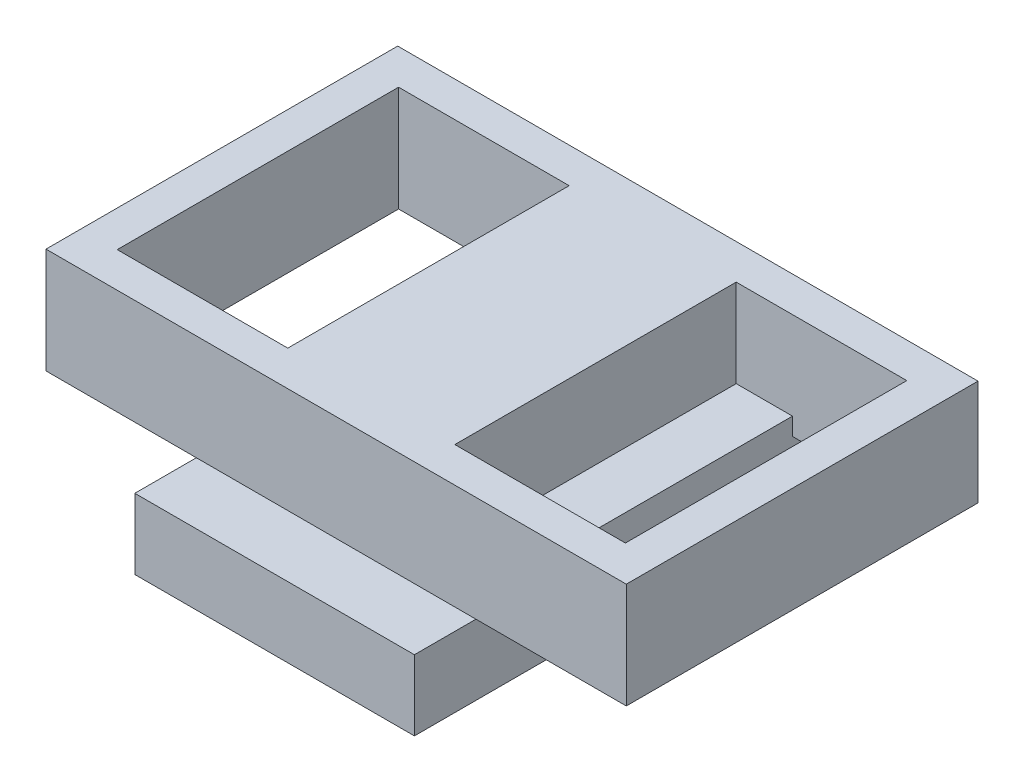
ISO-10303-21;
HEADER;
FILE_DESCRIPTION(('STEP AP214'),'2;1');
FILE_NAME('part.step','',(''),(''),'','','');
FILE_SCHEMA(('AUTOMOTIVE_DESIGN { 1 0 10303 214 1 1 1 1 }'));
ENDSEC;
DATA;
#1=APPLICATION_CONTEXT('core data for automotive mechanical design processes');
#2=APPLICATION_PROTOCOL_DEFINITION('international standard','automotive_design',2000,#1);
#3=PRODUCT_CONTEXT('',#1,'mechanical');
#4=PRODUCT('Part','Part','',(#3));
#5=PRODUCT_RELATED_PRODUCT_CATEGORY('part','',(#4));
#6=PRODUCT_DEFINITION_FORMATION('','',#4);
#7=PRODUCT_DEFINITION_CONTEXT('part definition',#1,'design');
#8=PRODUCT_DEFINITION('design','',#6,#7);
#9=PRODUCT_DEFINITION_SHAPE('','',#8);
#10=(LENGTH_UNIT() NAMED_UNIT(*) SI_UNIT(.MILLI.,.METRE.));
#11=(NAMED_UNIT(*) PLANE_ANGLE_UNIT() SI_UNIT($,.RADIAN.));
#12=(NAMED_UNIT(*) SI_UNIT($,.STERADIAN.) SOLID_ANGLE_UNIT());
#13=UNCERTAINTY_MEASURE_WITH_UNIT(LENGTH_MEASURE(1.E-05),#10,'distance_accuracy_value','');
#14=(GEOMETRIC_REPRESENTATION_CONTEXT(3) GLOBAL_UNCERTAINTY_ASSIGNED_CONTEXT((#13)) GLOBAL_UNIT_ASSIGNED_CONTEXT((#10,
#11,#12)) REPRESENTATION_CONTEXT('',''));
#15=CARTESIAN_POINT('',(0.,0.,0.));
#16=DIRECTION('',(0.,0.,1.));
#17=DIRECTION('',(1.,0.,0.));
#18=AXIS2_PLACEMENT_3D('',#15,#16,#17);
#19=CARTESIAN_POINT('',(0.,0.,0.));
#20=DIRECTION('',(0.,1.,0.));
#21=DIRECTION('',(0.,0.,1.));
#22=AXIS2_PLACEMENT_3D('',#19,#20,#21);
#23=PLANE('',#22);
#24=DIRECTION('',(0.,0.,-1.));
#25=VECTOR('',#24,1.);
#26=CARTESIAN_POINT('',(-7.95,0.,-13.5));
#27=LINE('',#26,#25);
#28=CARTESIAN_POINT('',(-7.95,0.,10.));
#29=VERTEX_POINT('',#28);
#30=CARTESIAN_POINT('',(-7.95,0.,8.));
#31=VERTEX_POINT('',#30);
#32=EDGE_CURVE('E11',#29,#31,#27,.T.);
#33=ORIENTED_EDGE('',*,*,#32,.F.);
#34=DIRECTION('',(1.,0.,0.));
#35=VECTOR('',#34,1.);
#36=CARTESIAN_POINT('',(16.5,0.,10.));
#37=LINE('',#36,#35);
#38=CARTESIAN_POINT('',(-16.5,0.,10.));
#39=VERTEX_POINT('',#38);
#40=EDGE_CURVE('E375',#39,#29,#37,.T.);
#41=ORIENTED_EDGE('',*,*,#40,.F.);
#42=DIRECTION('',(0.,0.,1.));
#43=VECTOR('',#42,1.);
#44=CARTESIAN_POINT('',(-16.5,0.,10.));
#45=LINE('',#44,#43);
#46=CARTESIAN_POINT('',(-16.5,0.,-9.99999999999999));
#47=VERTEX_POINT('',#46);
#48=EDGE_CURVE('E325',#47,#39,#45,.T.);
#49=ORIENTED_EDGE('',*,*,#48,.F.);
#50=DIRECTION('',(-1.,0.,0.));
#51=VECTOR('',#50,1.);
#52=CARTESIAN_POINT('',(16.5,0.,-10.));
#53=LINE('',#52,#51);
#54=CARTESIAN_POINT('',(-7.95,0.,-9.99999999999999));
#55=VERTEX_POINT('',#54);
#56=EDGE_CURVE('E380',#55,#47,#53,.T.);
#57=ORIENTED_EDGE('',*,*,#56,.F.);
#58=CARTESIAN_POINT('',(-7.95,0.,-8.));
#59=VERTEX_POINT('',#58);
#60=EDGE_CURVE('E42',#59,#55,#27,.T.);
#61=ORIENTED_EDGE('',*,*,#60,.F.);
#62=DIRECTION('',(1.,0.,0.));
#63=VECTOR('',#62,1.);
#64=CARTESIAN_POINT('',(0.,0.,-8.00000000000001));
#65=LINE('',#64,#63);
#66=CARTESIAN_POINT('',(-14.45,0.,-8.));
#67=VERTEX_POINT('',#66);
#68=EDGE_CURVE('E279',#67,#59,#65,.T.);
#69=ORIENTED_EDGE('',*,*,#68,.F.);
#70=DIRECTION('',(0.,0.,1.));
#71=VECTOR('',#70,1.);
#72=CARTESIAN_POINT('',(-14.45,0.,0.));
#73=LINE('',#72,#71);
#74=CARTESIAN_POINT('',(-14.45,0.,8.));
#75=VERTEX_POINT('',#74);
#76=EDGE_CURVE('E282',#67,#75,#73,.T.);
#77=ORIENTED_EDGE('',*,*,#76,.T.);
#78=DIRECTION('',(1.,0.,0.));
#79=VECTOR('',#78,1.);
#80=CARTESIAN_POINT('',(0.,0.,7.99999999999999));
#81=LINE('',#80,#79);
#82=EDGE_CURVE('E286',#75,#31,#81,.T.);
#83=ORIENTED_EDGE('',*,*,#82,.T.);
#84=EDGE_LOOP('',(#33,#41,#49,#57,#61,#69,#77,#83));
#85=FACE_BOUND('',#84,.T.);
#86=ADVANCED_FACE('F33',(#85),#23,.F.);
#87=DIRECTION('',(0.,0.,1.));
#88=VECTOR('',#87,1.);
#89=CARTESIAN_POINT('',(7.95,0.,-13.5));
#90=LINE('',#89,#88);
#91=CARTESIAN_POINT('',(7.95,0.,-9.99999999999999));
#92=VERTEX_POINT('',#91);
#93=CARTESIAN_POINT('',(7.95,0.,-8.00000000000001));
#94=VERTEX_POINT('',#93);
#95=EDGE_CURVE('E405',#92,#94,#90,.T.);
#96=ORIENTED_EDGE('',*,*,#95,.F.);
#97=CARTESIAN_POINT('',(16.5,0.,-10.));
#98=VERTEX_POINT('',#97);
#99=EDGE_CURVE('E365',#98,#92,#53,.T.);
#100=ORIENTED_EDGE('',*,*,#99,.F.);
#101=DIRECTION('',(0.,0.,-1.));
#102=VECTOR('',#101,1.);
#103=CARTESIAN_POINT('',(16.5,0.,10.));
#104=LINE('',#103,#102);
#105=CARTESIAN_POINT('',(16.5,0.,10.));
#106=VERTEX_POINT('',#105);
#107=EDGE_CURVE('E377',#106,#98,#104,.T.);
#108=ORIENTED_EDGE('',*,*,#107,.F.);
#109=CARTESIAN_POINT('',(7.95,0.,10.));
#110=VERTEX_POINT('',#109);
#111=EDGE_CURVE('E374',#110,#106,#37,.T.);
#112=ORIENTED_EDGE('',*,*,#111,.F.);
#113=CARTESIAN_POINT('',(7.95,0.,7.99999999999999));
#114=VERTEX_POINT('',#113);
#115=EDGE_CURVE('E265',#114,#110,#90,.T.);
#116=ORIENTED_EDGE('',*,*,#115,.F.);
#117=DIRECTION('',(-1.,0.,0.));
#118=VECTOR('',#117,1.);
#119=CARTESIAN_POINT('',(0.,0.,7.99999999999999));
#120=LINE('',#119,#118);
#121=CARTESIAN_POINT('',(14.45,0.,8.));
#122=VERTEX_POINT('',#121);
#123=EDGE_CURVE('E295',#122,#114,#120,.T.);
#124=ORIENTED_EDGE('',*,*,#123,.F.);
#125=DIRECTION('',(0.,0.,1.));
#126=VECTOR('',#125,1.);
#127=CARTESIAN_POINT('',(14.45,0.,0.));
#128=LINE('',#127,#126);
#129=CARTESIAN_POINT('',(14.45,0.,-8.));
#130=VERTEX_POINT('',#129);
#131=EDGE_CURVE('E298',#130,#122,#128,.T.);
#132=ORIENTED_EDGE('',*,*,#131,.F.);
#133=DIRECTION('',(-1.,0.,0.));
#134=VECTOR('',#133,1.);
#135=CARTESIAN_POINT('',(0.,0.,-8.00000000000001));
#136=LINE('',#135,#134);
#137=EDGE_CURVE('E278',#130,#94,#136,.T.);
#138=ORIENTED_EDGE('',*,*,#137,.T.);
#139=EDGE_LOOP('',(#96,#100,#108,#112,#116,#124,#132,#138));
#140=FACE_BOUND('',#139,.T.);
#141=ADVANCED_FACE('F459',(#140),#23,.F.);
#142=CARTESIAN_POINT('',(0.,1.,0.));
#143=DIRECTION('',(0.,1.,0.));
#144=DIRECTION('',(0.,0.,1.));
#145=AXIS2_PLACEMENT_3D('',#142,#143,#144);
#146=PLANE('',#145);
#147=DIRECTION('',(1.,0.,0.));
#148=VECTOR('',#147,1.);
#149=CARTESIAN_POINT('',(-14.45,1.,-8.));
#150=LINE('',#149,#148);
#151=CARTESIAN_POINT('',(-7.95,1.,-8.));
#152=VERTEX_POINT('',#151);
#153=CARTESIAN_POINT('',(-4.75,1.,-8.00000000000001));
#154=VERTEX_POINT('',#153);
#155=EDGE_CURVE('E311',#152,#154,#150,.T.);
#156=ORIENTED_EDGE('',*,*,#155,.F.);
#157=DIRECTION('',(0.,0.,1.));
#158=VECTOR('',#157,1.);
#159=CARTESIAN_POINT('',(-7.95,1.,0.));
#160=LINE('',#159,#158);
#161=CARTESIAN_POINT('',(-7.95,1.,8.));
#162=VERTEX_POINT('',#161);
#163=EDGE_CURVE('E394',#152,#162,#160,.T.);
#164=ORIENTED_EDGE('',*,*,#163,.T.);
#165=DIRECTION('',(1.,0.,0.));
#166=VECTOR('',#165,1.);
#167=CARTESIAN_POINT('',(-14.45,1.,8.));
#168=LINE('',#167,#166);
#169=CARTESIAN_POINT('',(-4.75,1.,7.99999999999999));
#170=VERTEX_POINT('',#169);
#171=EDGE_CURVE('E305',#162,#170,#168,.T.);
#172=ORIENTED_EDGE('',*,*,#171,.T.);
#173=DIRECTION('',(0.,0.,1.));
#174=VECTOR('',#173,1.);
#175=CARTESIAN_POINT('',(-4.75,1.,-8.00000000000001));
#176=LINE('',#175,#174);
#177=EDGE_CURVE('E307',#154,#170,#176,.T.);
#178=ORIENTED_EDGE('',*,*,#177,.F.);
#179=EDGE_LOOP('',(#156,#164,#172,#178));
#180=FACE_BOUND('',#179,.T.);
#181=ADVANCED_FACE('F479',(#180),#146,.T.);
#182=CARTESIAN_POINT('',(0.,6.,0.));
#183=DIRECTION('',(0.,1.,0.));
#184=DIRECTION('',(0.,0.,1.));
#185=AXIS2_PLACEMENT_3D('',#182,#183,#184);
#186=PLANE('',#185);
#187=DIRECTION('',(0.,0.,1.));
#188=VECTOR('',#187,1.);
#189=CARTESIAN_POINT('',(-14.45,6.,-8.));
#190=LINE('',#189,#188);
#191=CARTESIAN_POINT('',(-14.45,6.,-8.));
#192=VERTEX_POINT('',#191);
#193=CARTESIAN_POINT('',(-14.45,6.,8.));
#194=VERTEX_POINT('',#193);
#195=EDGE_CURVE('E314',#192,#194,#190,.T.);
#196=ORIENTED_EDGE('',*,*,#195,.F.);
#197=DIRECTION('',(1.,0.,0.));
#198=VECTOR('',#197,1.);
#199=CARTESIAN_POINT('',(-14.45,6.,-8.));
#200=LINE('',#199,#198);
#201=CARTESIAN_POINT('',(-4.75,6.,-8.00000000000001));
#202=VERTEX_POINT('',#201);
#203=EDGE_CURVE('E308',#192,#202,#200,.T.);
#204=ORIENTED_EDGE('',*,*,#203,.T.);
#205=DIRECTION('',(0.,0.,1.));
#206=VECTOR('',#205,1.);
#207=CARTESIAN_POINT('',(-4.75,6.,-8.00000000000001));
#208=LINE('',#207,#206);
#209=CARTESIAN_POINT('',(-4.75,6.,7.99999999999999));
#210=VERTEX_POINT('',#209);
#211=EDGE_CURVE('E319',#202,#210,#208,.T.);
#212=ORIENTED_EDGE('',*,*,#211,.T.);
#213=DIRECTION('',(1.,0.,0.));
#214=VECTOR('',#213,1.);
#215=CARTESIAN_POINT('',(-14.45,6.,8.));
#216=LINE('',#215,#214);
#217=EDGE_CURVE('E316',#194,#210,#216,.T.);
#218=ORIENTED_EDGE('',*,*,#217,.F.);
#219=EDGE_LOOP('',(#196,#204,#212,#218));
#220=FACE_BOUND('',#219,.T.);
#221=DIRECTION('',(0.,0.,1.));
#222=VECTOR('',#221,1.);
#223=CARTESIAN_POINT('',(-16.5,6.,10.));
#224=LINE('',#223,#222);
#225=CARTESIAN_POINT('',(-16.5,6.,-9.99999999999999));
#226=VERTEX_POINT('',#225);
#227=CARTESIAN_POINT('',(-16.5,6.,10.));
#228=VERTEX_POINT('',#227);
#229=EDGE_CURVE('E361',#226,#228,#224,.T.);
#230=ORIENTED_EDGE('',*,*,#229,.T.);
#231=DIRECTION('',(1.,0.,0.));
#232=VECTOR('',#231,1.);
#233=CARTESIAN_POINT('',(16.5,6.,10.));
#234=LINE('',#233,#232);
#235=CARTESIAN_POINT('',(16.5,6.,10.));
#236=VERTEX_POINT('',#235);
#237=EDGE_CURVE('E364',#228,#236,#234,.T.);
#238=ORIENTED_EDGE('',*,*,#237,.T.);
#239=DIRECTION('',(0.,0.,-1.));
#240=VECTOR('',#239,1.);
#241=CARTESIAN_POINT('',(16.5,6.,10.));
#242=LINE('',#241,#240);
#243=CARTESIAN_POINT('',(16.5,6.,-10.));
#244=VERTEX_POINT('',#243);
#245=EDGE_CURVE('E367',#236,#244,#242,.T.);
#246=ORIENTED_EDGE('',*,*,#245,.T.);
#247=DIRECTION('',(-1.,0.,0.));
#248=VECTOR('',#247,1.);
#249=CARTESIAN_POINT('',(16.5,6.,-10.));
#250=LINE('',#249,#248);
#251=EDGE_CURVE('E369',#244,#226,#250,.T.);
#252=ORIENTED_EDGE('',*,*,#251,.T.);
#253=EDGE_LOOP('',(#230,#238,#246,#252));
#254=FACE_BOUND('',#253,.T.);
#255=DIRECTION('',(-1.,0.,0.));
#256=VECTOR('',#255,1.);
#257=CARTESIAN_POINT('',(14.45,6.,-8.));
#258=LINE('',#257,#256);
#259=CARTESIAN_POINT('',(14.45,6.,-8.));
#260=VERTEX_POINT('',#259);
#261=CARTESIAN_POINT('',(4.75,6.,-8.00000000000001));
#262=VERTEX_POINT('',#261);
#263=EDGE_CURVE('E346',#260,#262,#258,.T.);
#264=ORIENTED_EDGE('',*,*,#263,.F.);
#265=DIRECTION('',(0.,0.,1.));
#266=VECTOR('',#265,1.);
#267=CARTESIAN_POINT('',(14.45,6.,-8.));
#268=LINE('',#267,#266);
#269=CARTESIAN_POINT('',(14.45,6.,8.));
#270=VERTEX_POINT('',#269);
#271=EDGE_CURVE('E317',#260,#270,#268,.T.);
#272=ORIENTED_EDGE('',*,*,#271,.T.);
#273=DIRECTION('',(-1.,0.,0.));
#274=VECTOR('',#273,1.);
#275=CARTESIAN_POINT('',(14.45,6.,8.));
#276=LINE('',#275,#274);
#277=CARTESIAN_POINT('',(4.75,6.,7.99999999999999));
#278=VERTEX_POINT('',#277);
#279=EDGE_CURVE('E352',#270,#278,#276,.T.);
#280=ORIENTED_EDGE('',*,*,#279,.T.);
#281=DIRECTION('',(0.,0.,1.));
#282=VECTOR('',#281,1.);
#283=CARTESIAN_POINT('',(4.75,6.,-8.00000000000001));
#284=LINE('',#283,#282);
#285=EDGE_CURVE('E348',#262,#278,#284,.T.);
#286=ORIENTED_EDGE('',*,*,#285,.F.);
#287=EDGE_LOOP('',(#264,#272,#280,#286));
#288=FACE_BOUND('',#287,.T.);
#289=ADVANCED_FACE('F452',(#220,#254,#288),#186,.T.);
#290=CARTESIAN_POINT('',(-16.5,6.,10.));
#291=DIRECTION('',(1.,0.,0.));
#292=DIRECTION('',(0.,0.,-1.));
#293=AXIS2_PLACEMENT_3D('',#290,#291,#292);
#294=PLANE('',#293);
#295=ORIENTED_EDGE('',*,*,#48,.T.);
#296=DIRECTION('',(0.,-1.,0.));
#297=VECTOR('',#296,1.);
#298=CARTESIAN_POINT('',(-16.5,6.,10.));
#299=LINE('',#298,#297);
#300=EDGE_CURVE('E392',#228,#39,#299,.T.);
#301=ORIENTED_EDGE('',*,*,#300,.F.);
#302=ORIENTED_EDGE('',*,*,#229,.F.);
#303=DIRECTION('',(0.,-1.,0.));
#304=VECTOR('',#303,1.);
#305=CARTESIAN_POINT('',(-16.5,6.,-9.99999999999999));
#306=LINE('',#305,#304);
#307=EDGE_CURVE('E371',#226,#47,#306,.T.);
#308=ORIENTED_EDGE('',*,*,#307,.T.);
#309=EDGE_LOOP('',(#295,#301,#302,#308));
#310=FACE_BOUND('',#309,.T.);
#311=ADVANCED_FACE('F35',(#310),#294,.F.);
#312=CARTESIAN_POINT('',(16.5,6.,10.));
#313=DIRECTION('',(0.,0.,-1.));
#314=DIRECTION('',(-1.,0.,0.));
#315=AXIS2_PLACEMENT_3D('',#312,#313,#314);
#316=PLANE('',#315);
#317=ORIENTED_EDGE('',*,*,#40,.T.);
#318=EDGE_CURVE('E378',#29,#110,#37,.T.);
#319=ORIENTED_EDGE('',*,*,#318,.T.);
#320=ORIENTED_EDGE('',*,*,#111,.T.);
#321=DIRECTION('',(0.,-1.,0.));
#322=VECTOR('',#321,1.);
#323=CARTESIAN_POINT('',(16.5,6.,10.));
#324=LINE('',#323,#322);
#325=EDGE_CURVE('E389',#236,#106,#324,.T.);
#326=ORIENTED_EDGE('',*,*,#325,.F.);
#327=ORIENTED_EDGE('',*,*,#237,.F.);
#328=ORIENTED_EDGE('',*,*,#300,.T.);
#329=EDGE_LOOP('',(#317,#319,#320,#326,#327,#328));
#330=FACE_BOUND('',#329,.T.);
#331=ADVANCED_FACE('F448',(#330),#316,.F.);
#332=CARTESIAN_POINT('',(16.5,6.,10.));
#333=DIRECTION('',(-1.,0.,0.));
#334=DIRECTION('',(0.,0.,1.));
#335=AXIS2_PLACEMENT_3D('',#332,#333,#334);
#336=PLANE('',#335);
#337=ORIENTED_EDGE('',*,*,#107,.T.);
#338=DIRECTION('',(0.,-1.,0.));
#339=VECTOR('',#338,1.);
#340=CARTESIAN_POINT('',(16.5,6.,-10.));
#341=LINE('',#340,#339);
#342=EDGE_CURVE('E386',#244,#98,#341,.T.);
#343=ORIENTED_EDGE('',*,*,#342,.F.);
#344=ORIENTED_EDGE('',*,*,#245,.F.);
#345=ORIENTED_EDGE('',*,*,#325,.T.);
#346=EDGE_LOOP('',(#337,#343,#344,#345));
#347=FACE_BOUND('',#346,.T.);
#348=ADVANCED_FACE('F497',(#347),#336,.F.);
#349=CARTESIAN_POINT('',(16.5,6.,-10.));
#350=DIRECTION('',(0.,0.,1.));
#351=DIRECTION('',(1.,0.,0.));
#352=AXIS2_PLACEMENT_3D('',#349,#350,#351);
#353=PLANE('',#352);
#354=ORIENTED_EDGE('',*,*,#99,.T.);
#355=EDGE_CURVE('E383',#92,#55,#53,.T.);
#356=ORIENTED_EDGE('',*,*,#355,.T.);
#357=ORIENTED_EDGE('',*,*,#56,.T.);
#358=ORIENTED_EDGE('',*,*,#307,.F.);
#359=ORIENTED_EDGE('',*,*,#251,.F.);
#360=ORIENTED_EDGE('',*,*,#342,.T.);
#361=EDGE_LOOP('',(#354,#356,#357,#358,#359,#360));
#362=FACE_BOUND('',#361,.T.);
#363=ADVANCED_FACE('F441',(#362),#353,.F.);
#364=CARTESIAN_POINT('',(14.45,1.,-8.));
#365=DIRECTION('',(-1.,0.,0.));
#366=DIRECTION('',(0.,0.,1.));
#367=AXIS2_PLACEMENT_3D('',#364,#365,#366);
#368=PLANE('',#367);
#369=ORIENTED_EDGE('',*,*,#271,.F.);
#370=DIRECTION('',(0.,1.,0.));
#371=VECTOR('',#370,1.);
#372=CARTESIAN_POINT('',(14.45,1.,-8.));
#373=LINE('',#372,#371);
#374=EDGE_CURVE('E342',#130,#260,#373,.T.);
#375=ORIENTED_EDGE('',*,*,#374,.F.);
#376=ORIENTED_EDGE('',*,*,#131,.T.);
#377=DIRECTION('',(0.,1.,0.));
#378=VECTOR('',#377,1.);
#379=CARTESIAN_POINT('',(14.45,1.,8.));
#380=LINE('',#379,#378);
#381=EDGE_CURVE('E291',#122,#270,#380,.T.);
#382=ORIENTED_EDGE('',*,*,#381,.T.);
#383=EDGE_LOOP('',(#369,#375,#376,#382));
#384=FACE_BOUND('',#383,.T.);
#385=ADVANCED_FACE('F477',(#384),#368,.T.);
#386=CARTESIAN_POINT('',(14.45,1.,8.));
#387=DIRECTION('',(0.,0.,-1.));
#388=DIRECTION('',(-1.,0.,0.));
#389=AXIS2_PLACEMENT_3D('',#386,#387,#388);
#390=PLANE('',#389);
#391=DIRECTION('',(0.,1.,0.));
#392=VECTOR('',#391,1.);
#393=CARTESIAN_POINT('',(4.75,1.,7.99999999999999));
#394=LINE('',#393,#392);
#395=CARTESIAN_POINT('',(4.75,1.,7.99999999999999));
#396=VERTEX_POINT('',#395);
#397=EDGE_CURVE('E336',#396,#278,#394,.T.);
#398=ORIENTED_EDGE('',*,*,#397,.T.);
#399=ORIENTED_EDGE('',*,*,#279,.F.);
#400=ORIENTED_EDGE('',*,*,#381,.F.);
#401=ORIENTED_EDGE('',*,*,#123,.T.);
#402=DIRECTION('',(0.,1.,0.));
#403=VECTOR('',#402,1.);
#404=CARTESIAN_POINT('',(7.95,0.,7.99999999999999));
#405=LINE('',#404,#403);
#406=CARTESIAN_POINT('',(7.95,1.,7.99999999999999));
#407=VERTEX_POINT('',#406);
#408=EDGE_CURVE('E283',#114,#407,#405,.T.);
#409=ORIENTED_EDGE('',*,*,#408,.T.);
#410=DIRECTION('',(-1.,0.,0.));
#411=VECTOR('',#410,1.);
#412=CARTESIAN_POINT('',(14.45,1.,8.));
#413=LINE('',#412,#411);
#414=EDGE_CURVE('E349',#407,#396,#413,.T.);
#415=ORIENTED_EDGE('',*,*,#414,.T.);
#416=EDGE_LOOP('',(#398,#399,#400,#401,#409,#415));
#417=FACE_BOUND('',#416,.T.);
#418=ADVANCED_FACE('F469',(#417),#390,.T.);
#419=CARTESIAN_POINT('',(4.75,1.,-8.00000000000001));
#420=DIRECTION('',(-1.,0.,0.));
#421=DIRECTION('',(0.,0.,1.));
#422=AXIS2_PLACEMENT_3D('',#419,#420,#421);
#423=PLANE('',#422);
#424=ORIENTED_EDGE('',*,*,#285,.T.);
#425=ORIENTED_EDGE('',*,*,#397,.F.);
#426=DIRECTION('',(0.,0.,1.));
#427=VECTOR('',#426,1.);
#428=CARTESIAN_POINT('',(4.75,1.,-8.00000000000001));
#429=LINE('',#428,#427);
#430=CARTESIAN_POINT('',(4.75,1.,-8.00000000000001));
#431=VERTEX_POINT('',#430);
#432=EDGE_CURVE('E357',#431,#396,#429,.T.);
#433=ORIENTED_EDGE('',*,*,#432,.F.);
#434=DIRECTION('',(0.,1.,0.));
#435=VECTOR('',#434,1.);
#436=CARTESIAN_POINT('',(4.75,1.,-8.00000000000001));
#437=LINE('',#436,#435);
#438=EDGE_CURVE('E339',#431,#262,#437,.T.);
#439=ORIENTED_EDGE('',*,*,#438,.T.);
#440=EDGE_LOOP('',(#424,#425,#433,#439));
#441=FACE_BOUND('',#440,.T.);
#442=ADVANCED_FACE('F474',(#441),#423,.F.);
#443=CARTESIAN_POINT('',(14.45,1.,-8.));
#444=DIRECTION('',(0.,0.,-1.));
#445=DIRECTION('',(-1.,0.,0.));
#446=AXIS2_PLACEMENT_3D('',#443,#444,#445);
#447=PLANE('',#446);
#448=DIRECTION('',(-1.,0.,0.));
#449=VECTOR('',#448,1.);
#450=CARTESIAN_POINT('',(14.45,1.,-8.));
#451=LINE('',#450,#449);
#452=CARTESIAN_POINT('',(7.95,1.,-8.00000000000001));
#453=VERTEX_POINT('',#452);
#454=EDGE_CURVE('E345',#453,#431,#451,.T.);
#455=ORIENTED_EDGE('',*,*,#454,.F.);
#456=DIRECTION('',(0.,1.,0.));
#457=VECTOR('',#456,1.);
#458=CARTESIAN_POINT('',(7.95,0.,-8.00000000000001));
#459=LINE('',#458,#457);
#460=EDGE_CURVE('E301',#94,#453,#459,.T.);
#461=ORIENTED_EDGE('',*,*,#460,.F.);
#462=ORIENTED_EDGE('',*,*,#137,.F.);
#463=ORIENTED_EDGE('',*,*,#374,.T.);
#464=ORIENTED_EDGE('',*,*,#263,.T.);
#465=ORIENTED_EDGE('',*,*,#438,.F.);
#466=EDGE_LOOP('',(#455,#461,#462,#463,#464,#465));
#467=FACE_BOUND('',#466,.T.);
#468=ADVANCED_FACE('F465',(#467),#447,.F.);
#469=CARTESIAN_POINT('',(0.,1.,0.));
#470=DIRECTION('',(0.,-1.,0.));
#471=DIRECTION('',(0.,0.,-1.));
#472=AXIS2_PLACEMENT_3D('',#469,#470,#471);
#473=PLANE('',#472);
#474=ORIENTED_EDGE('',*,*,#414,.F.);
#475=DIRECTION('',(0.,0.,-1.));
#476=VECTOR('',#475,1.);
#477=CARTESIAN_POINT('',(7.95,1.,0.));
#478=LINE('',#477,#476);
#479=EDGE_CURVE('E37',#407,#453,#478,.T.);
#480=ORIENTED_EDGE('',*,*,#479,.T.);
#481=ORIENTED_EDGE('',*,*,#454,.T.);
#482=ORIENTED_EDGE('',*,*,#432,.T.);
#483=EDGE_LOOP('',(#474,#480,#481,#482));
#484=FACE_BOUND('',#483,.T.);
#485=ADVANCED_FACE('F471',(#484),#473,.F.);
#486=CARTESIAN_POINT('',(-14.45,1.,-8.));
#487=DIRECTION('',(-1.,0.,0.));
#488=DIRECTION('',(0.,0.,1.));
#489=AXIS2_PLACEMENT_3D('',#486,#487,#488);
#490=PLANE('',#489);
#491=ORIENTED_EDGE('',*,*,#195,.T.);
#492=DIRECTION('',(0.,1.,0.));
#493=VECTOR('',#492,1.);
#494=CARTESIAN_POINT('',(-14.45,1.,8.));
#495=LINE('',#494,#493);
#496=EDGE_CURVE('E313',#75,#194,#495,.T.);
#497=ORIENTED_EDGE('',*,*,#496,.F.);
#498=ORIENTED_EDGE('',*,*,#76,.F.);
#499=DIRECTION('',(0.,1.,0.));
#500=VECTOR('',#499,1.);
#501=CARTESIAN_POINT('',(-14.45,1.,-8.));
#502=LINE('',#501,#500);
#503=EDGE_CURVE('E323',#67,#192,#502,.T.);
#504=ORIENTED_EDGE('',*,*,#503,.T.);
#505=EDGE_LOOP('',(#491,#497,#498,#504));
#506=FACE_BOUND('',#505,.T.);
#507=ADVANCED_FACE('F545',(#506),#490,.F.);
#508=CARTESIAN_POINT('',(-14.45,1.,-8.));
#509=DIRECTION('',(0.,0.,1.));
#510=DIRECTION('',(1.,0.,0.));
#511=AXIS2_PLACEMENT_3D('',#508,#509,#510);
#512=PLANE('',#511);
#513=DIRECTION('',(0.,1.,0.));
#514=VECTOR('',#513,1.);
#515=CARTESIAN_POINT('',(-7.95,0.,-8.));
#516=LINE('',#515,#514);
#517=EDGE_CURVE('E288',#59,#152,#516,.T.);
#518=ORIENTED_EDGE('',*,*,#517,.T.);
#519=ORIENTED_EDGE('',*,*,#155,.T.);
#520=DIRECTION('',(0.,1.,0.));
#521=VECTOR('',#520,1.);
#522=CARTESIAN_POINT('',(-4.75,1.,-8.00000000000001));
#523=LINE('',#522,#521);
#524=EDGE_CURVE('E326',#154,#202,#523,.T.);
#525=ORIENTED_EDGE('',*,*,#524,.T.);
#526=ORIENTED_EDGE('',*,*,#203,.F.);
#527=ORIENTED_EDGE('',*,*,#503,.F.);
#528=ORIENTED_EDGE('',*,*,#68,.T.);
#529=EDGE_LOOP('',(#518,#519,#525,#526,#527,#528));
#530=FACE_BOUND('',#529,.T.);
#531=ADVANCED_FACE('F551',(#530),#512,.T.);
#532=CARTESIAN_POINT('',(-4.75,1.,-8.00000000000001));
#533=DIRECTION('',(-1.,0.,0.));
#534=DIRECTION('',(0.,0.,1.));
#535=AXIS2_PLACEMENT_3D('',#532,#533,#534);
#536=PLANE('',#535);
#537=ORIENTED_EDGE('',*,*,#211,.F.);
#538=ORIENTED_EDGE('',*,*,#524,.F.);
#539=ORIENTED_EDGE('',*,*,#177,.T.);
#540=DIRECTION('',(0.,1.,0.));
#541=VECTOR('',#540,1.);
#542=CARTESIAN_POINT('',(-4.75,1.,7.99999999999999));
#543=LINE('',#542,#541);
#544=EDGE_CURVE('E329',#170,#210,#543,.T.);
#545=ORIENTED_EDGE('',*,*,#544,.T.);
#546=EDGE_LOOP('',(#537,#538,#539,#545));
#547=FACE_BOUND('',#546,.T.);
#548=ADVANCED_FACE('F558',(#547),#536,.T.);
#549=CARTESIAN_POINT('',(-14.45,1.,8.));
#550=DIRECTION('',(0.,0.,1.));
#551=DIRECTION('',(1.,0.,0.));
#552=AXIS2_PLACEMENT_3D('',#549,#550,#551);
#553=PLANE('',#552);
#554=ORIENTED_EDGE('',*,*,#217,.T.);
#555=ORIENTED_EDGE('',*,*,#544,.F.);
#556=ORIENTED_EDGE('',*,*,#171,.F.);
#557=DIRECTION('',(0.,1.,0.));
#558=VECTOR('',#557,1.);
#559=CARTESIAN_POINT('',(-7.95,0.,8.));
#560=LINE('',#559,#558);
#561=EDGE_CURVE('E289',#31,#162,#560,.T.);
#562=ORIENTED_EDGE('',*,*,#561,.F.);
#563=ORIENTED_EDGE('',*,*,#82,.F.);
#564=ORIENTED_EDGE('',*,*,#496,.T.);
#565=EDGE_LOOP('',(#554,#555,#556,#562,#563,#564));
#566=FACE_BOUND('',#565,.T.);
#567=ADVANCED_FACE('F566',(#566),#553,.F.);
#568=CARTESIAN_POINT('',(-7.95,0.,0.));
#569=DIRECTION('',(-1.,0.,0.));
#570=DIRECTION('',(0.,0.,1.));
#571=AXIS2_PLACEMENT_3D('',#568,#569,#570);
#572=PLANE('',#571);
#573=ORIENTED_EDGE('',*,*,#517,.F.);
#574=ORIENTED_EDGE('',*,*,#60,.T.);
#575=CARTESIAN_POINT('',(-7.95,0.,-13.5));
#576=VERTEX_POINT('',#575);
#577=EDGE_CURVE('E44',#55,#576,#27,.T.);
#578=ORIENTED_EDGE('',*,*,#577,.T.);
#579=DIRECTION('',(0.,1.,0.));
#580=VECTOR('',#579,1.);
#581=CARTESIAN_POINT('',(-7.95,-4.,-13.5));
#582=LINE('',#581,#580);
#583=CARTESIAN_POINT('',(-7.95,-4.,-13.5));
#584=VERTEX_POINT('',#583);
#585=EDGE_CURVE('E275',#584,#576,#582,.T.);
#586=ORIENTED_EDGE('',*,*,#585,.F.);
#587=DIRECTION('',(0.,0.,-1.));
#588=VECTOR('',#587,1.);
#589=CARTESIAN_POINT('',(-7.95,-4.,-13.5));
#590=LINE('',#589,#588);
#591=CARTESIAN_POINT('',(-7.95,-4.,13.5));
#592=VERTEX_POINT('',#591);
#593=EDGE_CURVE('E246',#592,#584,#590,.T.);
#594=ORIENTED_EDGE('',*,*,#593,.F.);
#595=DIRECTION('',(0.,1.,0.));
#596=VECTOR('',#595,1.);
#597=CARTESIAN_POINT('',(-7.95,-4.,13.5));
#598=LINE('',#597,#596);
#599=CARTESIAN_POINT('',(-7.95,0.,13.5));
#600=VERTEX_POINT('',#599);
#601=EDGE_CURVE('E255',#592,#600,#598,.T.);
#602=ORIENTED_EDGE('',*,*,#601,.T.);
#603=EDGE_CURVE('E256',#600,#29,#27,.T.);
#604=ORIENTED_EDGE('',*,*,#603,.T.);
#605=ORIENTED_EDGE('',*,*,#32,.T.);
#606=ORIENTED_EDGE('',*,*,#561,.T.);
#607=ORIENTED_EDGE('',*,*,#163,.F.);
#608=EDGE_LOOP('',(#573,#574,#578,#586,#594,#602,#604,#605,#606,#607));
#609=FACE_BOUND('',#608,.T.);
#610=ADVANCED_FACE('F425',(#609),#572,.T.);
#611=CARTESIAN_POINT('',(7.95,0.,0.));
#612=DIRECTION('',(-1.,0.,0.));
#613=DIRECTION('',(0.,0.,1.));
#614=AXIS2_PLACEMENT_3D('',#611,#612,#613);
#615=PLANE('',#614);
#616=ORIENTED_EDGE('',*,*,#408,.F.);
#617=ORIENTED_EDGE('',*,*,#115,.T.);
#618=CARTESIAN_POINT('',(7.95,0.,13.5));
#619=VERTEX_POINT('',#618);
#620=EDGE_CURVE('E261',#110,#619,#90,.T.);
#621=ORIENTED_EDGE('',*,*,#620,.T.);
#622=DIRECTION('',(0.,1.,0.));
#623=VECTOR('',#622,1.);
#624=CARTESIAN_POINT('',(7.95,-4.,13.5));
#625=LINE('',#624,#623);
#626=CARTESIAN_POINT('',(7.95,-4.,13.5));
#627=VERTEX_POINT('',#626);
#628=EDGE_CURVE('E269',#627,#619,#625,.T.);
#629=ORIENTED_EDGE('',*,*,#628,.F.);
#630=DIRECTION('',(0.,0.,1.));
#631=VECTOR('',#630,1.);
#632=CARTESIAN_POINT('',(7.95,-4.,-13.5));
#633=LINE('',#632,#631);
#634=CARTESIAN_POINT('',(7.95,-4.,-13.5));
#635=VERTEX_POINT('',#634);
#636=EDGE_CURVE('E252',#635,#627,#633,.T.);
#637=ORIENTED_EDGE('',*,*,#636,.F.);
#638=DIRECTION('',(0.,1.,0.));
#639=VECTOR('',#638,1.);
#640=CARTESIAN_POINT('',(7.95,-4.,-13.5));
#641=LINE('',#640,#639);
#642=CARTESIAN_POINT('',(7.95,0.,-13.5));
#643=VERTEX_POINT('',#642);
#644=EDGE_CURVE('E272',#635,#643,#641,.T.);
#645=ORIENTED_EDGE('',*,*,#644,.T.);
#646=EDGE_CURVE('E262',#643,#92,#90,.T.);
#647=ORIENTED_EDGE('',*,*,#646,.T.);
#648=ORIENTED_EDGE('',*,*,#95,.T.);
#649=ORIENTED_EDGE('',*,*,#460,.T.);
#650=ORIENTED_EDGE('',*,*,#479,.F.);
#651=EDGE_LOOP('',(#616,#617,#621,#629,#637,#645,#647,#648,#649,#650));
#652=FACE_BOUND('',#651,.T.);
#653=ADVANCED_FACE('F412',(#652),#615,.F.);
#654=CARTESIAN_POINT('',(0.,0.,0.));
#655=DIRECTION('',(0.,-1.,0.));
#656=DIRECTION('',(0.,0.,-1.));
#657=AXIS2_PLACEMENT_3D('',#654,#655,#656);
#658=PLANE('',#657);
#659=ORIENTED_EDGE('',*,*,#355,.F.);
#660=ORIENTED_EDGE('',*,*,#646,.F.);
#661=DIRECTION('',(1.,0.,0.));
#662=VECTOR('',#661,1.);
#663=CARTESIAN_POINT('',(7.95,0.,-13.5));
#664=LINE('',#663,#662);
#665=EDGE_CURVE('E259',#576,#643,#664,.T.);
#666=ORIENTED_EDGE('',*,*,#665,.F.);
#667=ORIENTED_EDGE('',*,*,#577,.F.);
#668=EDGE_LOOP('',(#659,#660,#666,#667));
#669=FACE_BOUND('',#668,.T.);
#670=ADVANCED_FACE('F436',(#669),#658,.F.);
#671=CARTESIAN_POINT('',(7.95,-4.,-13.5));
#672=DIRECTION('',(0.,0.,1.));
#673=DIRECTION('',(1.,0.,0.));
#674=AXIS2_PLACEMENT_3D('',#671,#672,#673);
#675=PLANE('',#674);
#676=ORIENTED_EDGE('',*,*,#665,.T.);
#677=ORIENTED_EDGE('',*,*,#644,.F.);
#678=DIRECTION('',(1.,0.,0.));
#679=VECTOR('',#678,1.);
#680=CARTESIAN_POINT('',(7.95,-4.,-13.5));
#681=LINE('',#680,#679);
#682=EDGE_CURVE('E249',#584,#635,#681,.T.);
#683=ORIENTED_EDGE('',*,*,#682,.F.);
#684=ORIENTED_EDGE('',*,*,#585,.T.);
#685=EDGE_LOOP('',(#676,#677,#683,#684));
#686=FACE_BOUND('',#685,.T.);
#687=ADVANCED_FACE('F593',(#686),#675,.F.);
#688=CARTESIAN_POINT('',(7.95,-4.,13.5));
#689=DIRECTION('',(0.,0.,-1.));
#690=DIRECTION('',(-1.,0.,0.));
#691=AXIS2_PLACEMENT_3D('',#688,#689,#690);
#692=PLANE('',#691);
#693=DIRECTION('',(-1.,0.,0.));
#694=VECTOR('',#693,1.);
#695=CARTESIAN_POINT('',(7.95,0.,13.5));
#696=LINE('',#695,#694);
#697=EDGE_CURVE('E250',#619,#600,#696,.T.);
#698=ORIENTED_EDGE('',*,*,#697,.T.);
#699=ORIENTED_EDGE('',*,*,#601,.F.);
#700=DIRECTION('',(-1.,0.,0.));
#701=VECTOR('',#700,1.);
#702=CARTESIAN_POINT('',(7.95,-4.,13.5));
#703=LINE('',#702,#701);
#704=EDGE_CURVE('E254',#627,#592,#703,.T.);
#705=ORIENTED_EDGE('',*,*,#704,.F.);
#706=ORIENTED_EDGE('',*,*,#628,.T.);
#707=EDGE_LOOP('',(#698,#699,#705,#706));
#708=FACE_BOUND('',#707,.T.);
#709=ADVANCED_FACE('F419',(#708),#692,.F.);
#710=CARTESIAN_POINT('',(0.,-4.,0.));
#711=DIRECTION('',(0.,-1.,0.));
#712=DIRECTION('',(0.,0.,-1.));
#713=AXIS2_PLACEMENT_3D('',#710,#711,#712);
#714=PLANE('',#713);
#715=DIRECTION('',(0.,0.,-1.));
#716=VECTOR('',#715,1.);
#717=CARTESIAN_POINT('',(-5.25,-4.,-11.75));
#718=LINE('',#717,#716);
#719=CARTESIAN_POINT('',(-5.25,-4.,11.75));
#720=VERTEX_POINT('',#719);
#721=CARTESIAN_POINT('',(-5.25,-4.,-11.75));
#722=VERTEX_POINT('',#721);
#723=EDGE_CURVE('E51',#720,#722,#718,.T.);
#724=ORIENTED_EDGE('',*,*,#723,.F.);
#725=DIRECTION('',(-1.,0.,0.));
#726=VECTOR('',#725,1.);
#727=CARTESIAN_POINT('',(5.25,-4.,11.75));
#728=LINE('',#727,#726);
#729=CARTESIAN_POINT('',(5.25,-4.,11.75));
#730=VERTEX_POINT('',#729);
#731=EDGE_CURVE('E228',#730,#720,#728,.T.);
#732=ORIENTED_EDGE('',*,*,#731,.F.);
#733=DIRECTION('',(0.,0.,1.));
#734=VECTOR('',#733,1.);
#735=CARTESIAN_POINT('',(5.25,-4.,-11.75));
#736=LINE('',#735,#734);
#737=CARTESIAN_POINT('',(5.25,-4.,-11.75));
#738=VERTEX_POINT('',#737);
#739=EDGE_CURVE('E231',#738,#730,#736,.T.);
#740=ORIENTED_EDGE('',*,*,#739,.F.);
#741=DIRECTION('',(1.,0.,0.));
#742=VECTOR('',#741,1.);
#743=CARTESIAN_POINT('',(5.25,-4.,-11.75));
#744=LINE('',#743,#742);
#745=EDGE_CURVE('E237',#722,#738,#744,.T.);
#746=ORIENTED_EDGE('',*,*,#745,.F.);
#747=EDGE_LOOP('',(#724,#732,#740,#746));
#748=FACE_BOUND('',#747,.T.);
#749=ORIENTED_EDGE('',*,*,#593,.T.);
#750=ORIENTED_EDGE('',*,*,#682,.T.);
#751=ORIENTED_EDGE('',*,*,#636,.T.);
#752=ORIENTED_EDGE('',*,*,#704,.T.);
#753=EDGE_LOOP('',(#749,#750,#751,#752));
#754=FACE_BOUND('',#753,.T.);
#755=ADVANCED_FACE('F429',(#748,#754),#714,.T.);
#756=ORIENTED_EDGE('',*,*,#318,.F.);
#757=ORIENTED_EDGE('',*,*,#603,.F.);
#758=ORIENTED_EDGE('',*,*,#697,.F.);
#759=ORIENTED_EDGE('',*,*,#620,.F.);
#760=EDGE_LOOP('',(#756,#757,#758,#759));
#761=FACE_BOUND('',#760,.T.);
#762=ADVANCED_FACE('F422',(#761),#658,.F.);
#763=CARTESIAN_POINT('',(-5.25,-1.5,-11.75));
#764=DIRECTION('',(-1.,0.,0.));
#765=DIRECTION('',(0.,0.,1.));
#766=AXIS2_PLACEMENT_3D('',#763,#764,#765);
#767=PLANE('',#766);
#768=ORIENTED_EDGE('',*,*,#723,.T.);
#769=DIRECTION('',(0.,-1.,0.));
#770=VECTOR('',#769,1.);
#771=CARTESIAN_POINT('',(-5.25,-1.5,-11.75));
#772=LINE('',#771,#770);
#773=CARTESIAN_POINT('',(-5.25,-1.5,-11.75));
#774=VERTEX_POINT('',#773);
#775=EDGE_CURVE('E206',#774,#722,#772,.T.);
#776=ORIENTED_EDGE('',*,*,#775,.F.);
#777=DIRECTION('',(0.,0.,-1.));
#778=VECTOR('',#777,1.);
#779=CARTESIAN_POINT('',(-5.25,-1.5,-11.75));
#780=LINE('',#779,#778);
#781=CARTESIAN_POINT('',(-5.25,-1.5,11.75));
#782=VERTEX_POINT('',#781);
#783=EDGE_CURVE('E210',#782,#774,#780,.T.);
#784=ORIENTED_EDGE('',*,*,#783,.F.);
#785=DIRECTION('',(0.,-1.,0.));
#786=VECTOR('',#785,1.);
#787=CARTESIAN_POINT('',(-5.25,-1.5,11.75));
#788=LINE('',#787,#786);
#789=EDGE_CURVE('E241',#782,#720,#788,.T.);
#790=ORIENTED_EDGE('',*,*,#789,.T.);
#791=EDGE_LOOP('',(#768,#776,#784,#790));
#792=FACE_BOUND('',#791,.T.);
#793=ADVANCED_FACE('F208',(#792),#767,.F.);
#794=CARTESIAN_POINT('',(5.25,-1.5,11.75));
#795=DIRECTION('',(0.,0.,1.));
#796=DIRECTION('',(1.,0.,0.));
#797=AXIS2_PLACEMENT_3D('',#794,#795,#796);
#798=PLANE('',#797);
#799=ORIENTED_EDGE('',*,*,#731,.T.);
#800=ORIENTED_EDGE('',*,*,#789,.F.);
#801=DIRECTION('',(-1.,0.,0.));
#802=VECTOR('',#801,1.);
#803=CARTESIAN_POINT('',(5.25,-1.5,11.75));
#804=LINE('',#803,#802);
#805=CARTESIAN_POINT('',(5.25,-1.5,11.75));
#806=VERTEX_POINT('',#805);
#807=EDGE_CURVE('E216',#806,#782,#804,.T.);
#808=ORIENTED_EDGE('',*,*,#807,.F.);
#809=DIRECTION('',(0.,-1.,0.));
#810=VECTOR('',#809,1.);
#811=CARTESIAN_POINT('',(5.25,-1.5,11.75));
#812=LINE('',#811,#810);
#813=EDGE_CURVE('E243',#806,#730,#812,.T.);
#814=ORIENTED_EDGE('',*,*,#813,.T.);
#815=EDGE_LOOP('',(#799,#800,#808,#814));
#816=FACE_BOUND('',#815,.T.);
#817=ADVANCED_FACE('F624',(#816),#798,.F.);
#818=CARTESIAN_POINT('',(5.25,-1.5,-11.75));
#819=DIRECTION('',(1.,0.,0.));
#820=DIRECTION('',(0.,0.,-1.));
#821=AXIS2_PLACEMENT_3D('',#818,#819,#820);
#822=PLANE('',#821);
#823=ORIENTED_EDGE('',*,*,#739,.T.);
#824=ORIENTED_EDGE('',*,*,#813,.F.);
#825=DIRECTION('',(0.,0.,1.));
#826=VECTOR('',#825,1.);
#827=CARTESIAN_POINT('',(5.25,-1.5,-11.75));
#828=LINE('',#827,#826);
#829=CARTESIAN_POINT('',(5.25,-1.5,-11.75));
#830=VERTEX_POINT('',#829);
#831=EDGE_CURVE('E224',#830,#806,#828,.T.);
#832=ORIENTED_EDGE('',*,*,#831,.F.);
#833=DIRECTION('',(0.,-1.,0.));
#834=VECTOR('',#833,1.);
#835=CARTESIAN_POINT('',(5.25,-1.5,-11.75));
#836=LINE('',#835,#834);
#837=EDGE_CURVE('E215',#830,#738,#836,.T.);
#838=ORIENTED_EDGE('',*,*,#837,.T.);
#839=EDGE_LOOP('',(#823,#824,#832,#838));
#840=FACE_BOUND('',#839,.T.);
#841=ADVANCED_FACE('F631',(#840),#822,.F.);
#842=CARTESIAN_POINT('',(5.25,-1.5,-11.75));
#843=DIRECTION('',(0.,0.,-1.));
#844=DIRECTION('',(-1.,0.,0.));
#845=AXIS2_PLACEMENT_3D('',#842,#843,#844);
#846=PLANE('',#845);
#847=ORIENTED_EDGE('',*,*,#745,.T.);
#848=ORIENTED_EDGE('',*,*,#837,.F.);
#849=DIRECTION('',(1.,0.,0.));
#850=VECTOR('',#849,1.);
#851=CARTESIAN_POINT('',(5.25,-1.5,-11.75));
#852=LINE('',#851,#850);
#853=EDGE_CURVE('E219',#774,#830,#852,.T.);
#854=ORIENTED_EDGE('',*,*,#853,.F.);
#855=ORIENTED_EDGE('',*,*,#775,.T.);
#856=EDGE_LOOP('',(#847,#848,#854,#855));
#857=FACE_BOUND('',#856,.T.);
#858=ADVANCED_FACE('F220',(#857),#846,.F.);
#859=CARTESIAN_POINT('',(0.,-1.5,0.));
#860=DIRECTION('',(0.,-1.,0.));
#861=DIRECTION('',(0.,0.,-1.));
#862=AXIS2_PLACEMENT_3D('',#859,#860,#861);
#863=PLANE('',#862);
#864=ORIENTED_EDGE('',*,*,#783,.T.);
#865=ORIENTED_EDGE('',*,*,#853,.T.);
#866=ORIENTED_EDGE('',*,*,#831,.T.);
#867=ORIENTED_EDGE('',*,*,#807,.T.);
#868=EDGE_LOOP('',(#864,#865,#866,#867));
#869=FACE_BOUND('',#868,.T.);
#870=ADVANCED_FACE('F226',(#869),#863,.T.);
#871=CLOSED_SHELL('',(#86,#141,#181,#289,#311,#331,#348,#363,#385,#418,#442,#468,#485,#507,#531,
#548,#567,#610,#653,#670,#687,#709,#755,#762,#793,#817,#841,#858,#870));
#872=MANIFOLD_SOLID_BREP('B2',#871);
#873=ADVANCED_BREP_SHAPE_REPRESENTATION('',(#18,#872),#14);
#874=SHAPE_DEFINITION_REPRESENTATION(#9,#873);
ENDSEC;
END-ISO-10303-21;
